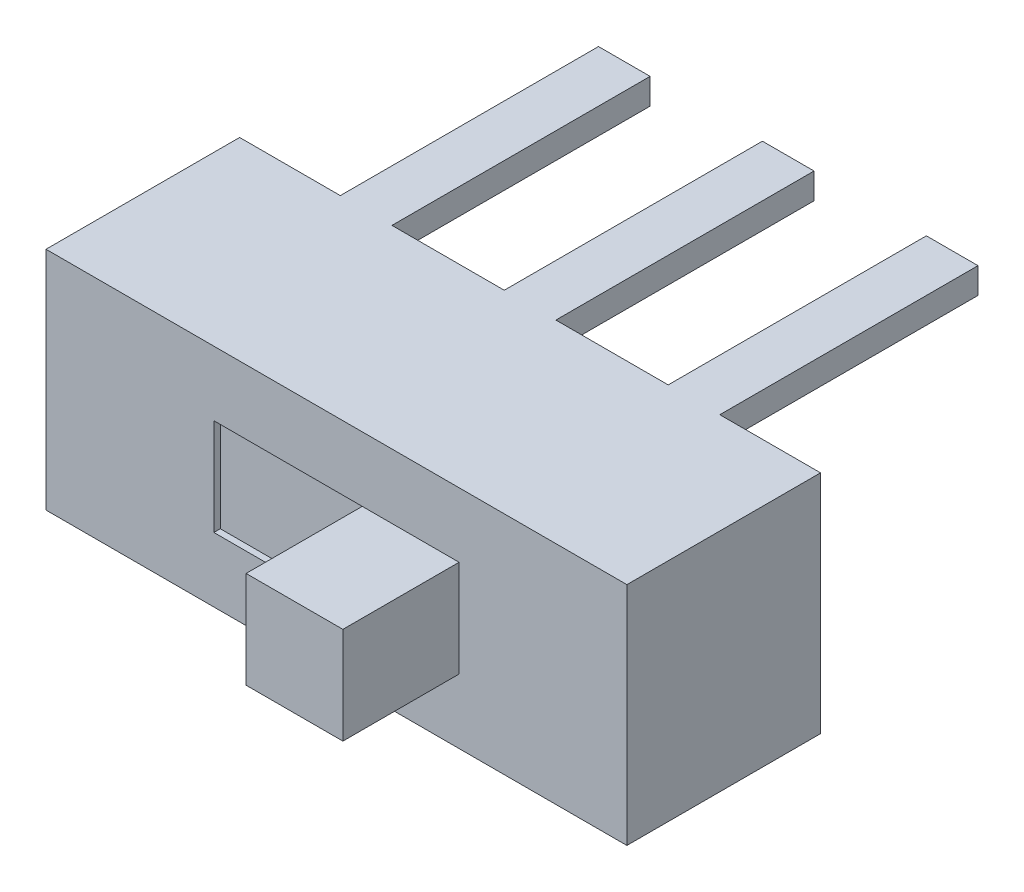
ISO-10303-21;
HEADER;
FILE_DESCRIPTION(('STEP AP214'),'2;1');
FILE_NAME('part.step','',(''),(''),'','','');
FILE_SCHEMA(('AUTOMOTIVE_DESIGN { 1 0 10303 214 1 1 1 1 }'));
ENDSEC;
DATA;
#1=APPLICATION_CONTEXT('core data for automotive mechanical design processes');
#2=APPLICATION_PROTOCOL_DEFINITION('international standard','automotive_design',2000,#1);
#3=PRODUCT_CONTEXT('',#1,'mechanical');
#4=PRODUCT('Part','Part','',(#3));
#5=PRODUCT_RELATED_PRODUCT_CATEGORY('part','',(#4));
#6=PRODUCT_DEFINITION_FORMATION('','',#4);
#7=PRODUCT_DEFINITION_CONTEXT('part definition',#1,'design');
#8=PRODUCT_DEFINITION('design','',#6,#7);
#9=PRODUCT_DEFINITION_SHAPE('','',#8);
#10=(LENGTH_UNIT() NAMED_UNIT(*) SI_UNIT(.MILLI.,.METRE.));
#11=(NAMED_UNIT(*) PLANE_ANGLE_UNIT() SI_UNIT($,.RADIAN.));
#12=(NAMED_UNIT(*) SI_UNIT($,.STERADIAN.) SOLID_ANGLE_UNIT());
#13=UNCERTAINTY_MEASURE_WITH_UNIT(LENGTH_MEASURE(1.E-05),#10,'distance_accuracy_value','');
#14=(GEOMETRIC_REPRESENTATION_CONTEXT(3) GLOBAL_UNCERTAINTY_ASSIGNED_CONTEXT((#13)) GLOBAL_UNIT_ASSIGNED_CONTEXT((#10,
#11,#12)) REPRESENTATION_CONTEXT('',''));
#15=CARTESIAN_POINT('',(0.,0.,0.));
#16=DIRECTION('',(0.,0.,1.));
#17=DIRECTION('',(1.,0.,0.));
#18=AXIS2_PLACEMENT_3D('',#15,#16,#17);
#19=CARTESIAN_POINT('',(-4.5,3.5,-1.5));
#20=DIRECTION('',(0.,0.,1.));
#21=DIRECTION('',(1.,0.,0.));
#22=AXIS2_PLACEMENT_3D('',#19,#20,#21);
#23=PLANE('',#22);
#24=DIRECTION('',(0.,-1.,0.));
#25=VECTOR('',#24,1.);
#26=CARTESIAN_POINT('',(-2.14,3.1,-1.5));
#27=LINE('',#26,#25);
#28=CARTESIAN_POINT('',(-2.14,3.5,-1.5));
#29=VERTEX_POINT('',#28);
#30=CARTESIAN_POINT('',(-2.14,3.1,-1.5));
#31=VERTEX_POINT('',#30);
#32=EDGE_CURVE('E390',#29,#31,#27,.T.);
#33=ORIENTED_EDGE('',*,*,#32,.F.);
#34=DIRECTION('',(-1.,0.,0.));
#35=VECTOR('',#34,1.);
#36=CARTESIAN_POINT('',(-4.5,3.5,-1.5));
#37=LINE('',#36,#35);
#38=CARTESIAN_POINT('',(-0.4,3.5,-1.5));
#39=VERTEX_POINT('',#38);
#40=EDGE_CURVE('E213',#39,#29,#37,.T.);
#41=ORIENTED_EDGE('',*,*,#40,.F.);
#42=DIRECTION('',(0.,1.,0.));
#43=VECTOR('',#42,1.);
#44=CARTESIAN_POINT('',(-0.4,3.1,-1.5));
#45=LINE('',#44,#43);
#46=CARTESIAN_POINT('',(-0.4,3.1,-1.5));
#47=VERTEX_POINT('',#46);
#48=EDGE_CURVE('E226',#47,#39,#45,.T.);
#49=ORIENTED_EDGE('',*,*,#48,.F.);
#50=DIRECTION('',(-1.,0.,0.));
#51=VECTOR('',#50,1.);
#52=CARTESIAN_POINT('',(0.4,3.1,-1.5));
#53=LINE('',#52,#51);
#54=CARTESIAN_POINT('',(0.4,3.1,-1.5));
#55=VERTEX_POINT('',#54);
#56=EDGE_CURVE('E216',#55,#47,#53,.T.);
#57=ORIENTED_EDGE('',*,*,#56,.F.);
#58=DIRECTION('',(0.,-1.,0.));
#59=VECTOR('',#58,1.);
#60=CARTESIAN_POINT('',(0.4,3.1,-1.5));
#61=LINE('',#60,#59);
#62=CARTESIAN_POINT('',(0.4,3.5,-1.5));
#63=VERTEX_POINT('',#62);
#64=EDGE_CURVE('E214',#63,#55,#61,.T.);
#65=ORIENTED_EDGE('',*,*,#64,.F.);
#66=CARTESIAN_POINT('',(2.14,3.5,-1.5));
#67=VERTEX_POINT('',#66);
#68=EDGE_CURVE('E333',#67,#63,#37,.T.);
#69=ORIENTED_EDGE('',*,*,#68,.F.);
#70=DIRECTION('',(0.,1.,0.));
#71=VECTOR('',#70,1.);
#72=CARTESIAN_POINT('',(2.14,3.1,-1.5));
#73=LINE('',#72,#71);
#74=CARTESIAN_POINT('',(2.14,3.1,-1.5));
#75=VERTEX_POINT('',#74);
#76=EDGE_CURVE('E243',#75,#67,#73,.T.);
#77=ORIENTED_EDGE('',*,*,#76,.F.);
#78=DIRECTION('',(-1.,0.,0.));
#79=VECTOR('',#78,1.);
#80=CARTESIAN_POINT('',(2.94,3.1,-1.5));
#81=LINE('',#80,#79);
#82=CARTESIAN_POINT('',(2.94,3.1,-1.5));
#83=VERTEX_POINT('',#82);
#84=EDGE_CURVE('E248',#83,#75,#81,.T.);
#85=ORIENTED_EDGE('',*,*,#84,.F.);
#86=DIRECTION('',(0.,-1.,0.));
#87=VECTOR('',#86,1.);
#88=CARTESIAN_POINT('',(2.94,3.1,-1.5));
#89=LINE('',#88,#87);
#90=CARTESIAN_POINT('',(2.94,3.5,-1.5));
#91=VERTEX_POINT('',#90);
#92=EDGE_CURVE('E257',#91,#83,#89,.T.);
#93=ORIENTED_EDGE('',*,*,#92,.F.);
#94=CARTESIAN_POINT('',(4.5,3.5,-1.5));
#95=VERTEX_POINT('',#94);
#96=EDGE_CURVE('E329',#95,#91,#37,.T.);
#97=ORIENTED_EDGE('',*,*,#96,.F.);
#98=DIRECTION('',(0.,-1.,0.));
#99=VECTOR('',#98,1.);
#100=CARTESIAN_POINT('',(4.5,3.5,-1.5));
#101=LINE('',#100,#99);
#102=CARTESIAN_POINT('',(4.5,0.,-1.5));
#103=VERTEX_POINT('',#102);
#104=EDGE_CURVE('E11',#95,#103,#101,.T.);
#105=ORIENTED_EDGE('',*,*,#104,.T.);
#106=DIRECTION('',(-1.,0.,0.));
#107=VECTOR('',#106,1.);
#108=CARTESIAN_POINT('',(-4.5,0.,-1.5));
#109=LINE('',#108,#107);
#110=CARTESIAN_POINT('',(-4.5,0.,-1.5));
#111=VERTEX_POINT('',#110);
#112=EDGE_CURVE('E340',#103,#111,#109,.T.);
#113=ORIENTED_EDGE('',*,*,#112,.T.);
#114=DIRECTION('',(0.,-1.,0.));
#115=VECTOR('',#114,1.);
#116=CARTESIAN_POINT('',(-4.5,3.5,-1.5));
#117=LINE('',#116,#115);
#118=CARTESIAN_POINT('',(-4.5,3.5,-1.5));
#119=VERTEX_POINT('',#118);
#120=EDGE_CURVE('E44',#119,#111,#117,.T.);
#121=ORIENTED_EDGE('',*,*,#120,.F.);
#122=CARTESIAN_POINT('',(-2.94,3.5,-1.5));
#123=VERTEX_POINT('',#122);
#124=EDGE_CURVE('E327',#123,#119,#37,.T.);
#125=ORIENTED_EDGE('',*,*,#124,.F.);
#126=DIRECTION('',(0.,1.,0.));
#127=VECTOR('',#126,1.);
#128=CARTESIAN_POINT('',(-2.94,3.1,-1.5));
#129=LINE('',#128,#127);
#130=CARTESIAN_POINT('',(-2.94,3.1,-1.5));
#131=VERTEX_POINT('',#130);
#132=EDGE_CURVE('E208',#131,#123,#129,.T.);
#133=ORIENTED_EDGE('',*,*,#132,.F.);
#134=DIRECTION('',(-1.,0.,0.));
#135=VECTOR('',#134,1.);
#136=CARTESIAN_POINT('',(-2.14,3.1,-1.5));
#137=LINE('',#136,#135);
#138=EDGE_CURVE('E391',#31,#131,#137,.T.);
#139=ORIENTED_EDGE('',*,*,#138,.F.);
#140=EDGE_LOOP('',(#33,#41,#49,#57,#65,#69,#77,#85,#93,#97,#105,#113,#121,#125,#133,#139));
#141=FACE_BOUND('',#140,.T.);
#142=ADVANCED_FACE('F36',(#141),#23,.F.);
#143=CARTESIAN_POINT('',(-1.9,1.,1.4));
#144=DIRECTION('',(0.,-1.,0.));
#145=DIRECTION('',(0.,0.,-1.));
#146=AXIS2_PLACEMENT_3D('',#143,#144,#145);
#147=PLANE('',#146);
#148=DIRECTION('',(0.,0.,-1.));
#149=VECTOR('',#148,1.);
#150=CARTESIAN_POINT('',(0.400000000000001,1.,3.3));
#151=LINE('',#150,#149);
#152=CARTESIAN_POINT('',(0.400000000000001,1.,1.5));
#153=VERTEX_POINT('',#152);
#154=CARTESIAN_POINT('',(0.400000000000001,1.,1.4));
#155=VERTEX_POINT('',#154);
#156=EDGE_CURVE('E287',#153,#155,#151,.T.);
#157=ORIENTED_EDGE('',*,*,#156,.T.);
#158=DIRECTION('',(1.,0.,0.));
#159=VECTOR('',#158,1.);
#160=CARTESIAN_POINT('',(-1.9,1.,1.4));
#161=LINE('',#160,#159);
#162=CARTESIAN_POINT('',(-1.9,1.,1.4));
#163=VERTEX_POINT('',#162);
#164=EDGE_CURVE('E307',#163,#155,#161,.T.);
#165=ORIENTED_EDGE('',*,*,#164,.F.);
#166=DIRECTION('',(0.,0.,1.));
#167=VECTOR('',#166,1.);
#168=CARTESIAN_POINT('',(-1.9,1.,1.4));
#169=LINE('',#168,#167);
#170=CARTESIAN_POINT('',(-1.9,1.,1.5));
#171=VERTEX_POINT('',#170);
#172=EDGE_CURVE('E320',#163,#171,#169,.T.);
#173=ORIENTED_EDGE('',*,*,#172,.T.);
#174=DIRECTION('',(1.,0.,0.));
#175=VECTOR('',#174,1.);
#176=CARTESIAN_POINT('',(-1.9,1.,1.5));
#177=LINE('',#176,#175);
#178=EDGE_CURVE('E304',#171,#153,#177,.T.);
#179=ORIENTED_EDGE('',*,*,#178,.T.);
#180=EDGE_LOOP('',(#157,#165,#173,#179));
#181=FACE_BOUND('',#180,.T.);
#182=ADVANCED_FACE('F413',(#181),#147,.F.);
#183=CARTESIAN_POINT('',(-1.9,2.5,1.4));
#184=DIRECTION('',(0.,1.,0.));
#185=DIRECTION('',(0.,0.,1.));
#186=AXIS2_PLACEMENT_3D('',#183,#184,#185);
#187=PLANE('',#186);
#188=DIRECTION('',(0.,0.,-1.));
#189=VECTOR('',#188,1.);
#190=CARTESIAN_POINT('',(0.4,2.5,3.3));
#191=LINE('',#190,#189);
#192=CARTESIAN_POINT('',(0.4,2.5,1.5));
#193=VERTEX_POINT('',#192);
#194=CARTESIAN_POINT('',(0.4,2.5,1.4));
#195=VERTEX_POINT('',#194);
#196=EDGE_CURVE('E291',#193,#195,#191,.T.);
#197=ORIENTED_EDGE('',*,*,#196,.F.);
#198=DIRECTION('',(-1.,0.,0.));
#199=VECTOR('',#198,1.);
#200=CARTESIAN_POINT('',(-1.9,2.5,1.5));
#201=LINE('',#200,#199);
#202=CARTESIAN_POINT('',(-1.9,2.5,1.5));
#203=VERTEX_POINT('',#202);
#204=EDGE_CURVE('E312',#193,#203,#201,.T.);
#205=ORIENTED_EDGE('',*,*,#204,.T.);
#206=DIRECTION('',(0.,0.,1.));
#207=VECTOR('',#206,1.);
#208=CARTESIAN_POINT('',(-1.9,2.5,1.4));
#209=LINE('',#208,#207);
#210=CARTESIAN_POINT('',(-1.9,2.5,1.4));
#211=VERTEX_POINT('',#210);
#212=EDGE_CURVE('E310',#211,#203,#209,.T.);
#213=ORIENTED_EDGE('',*,*,#212,.F.);
#214=DIRECTION('',(-1.,0.,0.));
#215=VECTOR('',#214,1.);
#216=CARTESIAN_POINT('',(-1.9,2.5,1.4));
#217=LINE('',#216,#215);
#218=EDGE_CURVE('E301',#195,#211,#217,.T.);
#219=ORIENTED_EDGE('',*,*,#218,.F.);
#220=EDGE_LOOP('',(#197,#205,#213,#219));
#221=FACE_BOUND('',#220,.T.);
#222=ADVANCED_FACE('F417',(#221),#187,.F.);
#223=CARTESIAN_POINT('',(0.,0.,1.4));
#224=DIRECTION('',(0.,0.,1.));
#225=DIRECTION('',(1.,0.,0.));
#226=AXIS2_PLACEMENT_3D('',#223,#224,#225);
#227=PLANE('',#226);
#228=ORIENTED_EDGE('',*,*,#164,.T.);
#229=DIRECTION('',(0.,-1.,0.));
#230=VECTOR('',#229,1.);
#231=CARTESIAN_POINT('',(0.4,2.5,1.4));
#232=LINE('',#231,#230);
#233=EDGE_CURVE('E273',#195,#155,#232,.T.);
#234=ORIENTED_EDGE('',*,*,#233,.F.);
#235=ORIENTED_EDGE('',*,*,#218,.T.);
#236=DIRECTION('',(0.,-1.,0.));
#237=VECTOR('',#236,1.);
#238=CARTESIAN_POINT('',(-1.9,2.5,1.4));
#239=LINE('',#238,#237);
#240=EDGE_CURVE('E303',#211,#163,#239,.T.);
#241=ORIENTED_EDGE('',*,*,#240,.T.);
#242=EDGE_LOOP('',(#228,#234,#235,#241));
#243=FACE_BOUND('',#242,.T.);
#244=ADVANCED_FACE('F433',(#243),#227,.T.);
#245=CARTESIAN_POINT('',(4.5,3.5,-1.5));
#246=DIRECTION('',(-1.,0.,0.));
#247=DIRECTION('',(0.,0.,1.));
#248=AXIS2_PLACEMENT_3D('',#245,#246,#247);
#249=PLANE('',#248);
#250=DIRECTION('',(0.,0.,-1.));
#251=VECTOR('',#250,1.);
#252=CARTESIAN_POINT('',(4.5,0.,-1.5));
#253=LINE('',#252,#251);
#254=CARTESIAN_POINT('',(4.5,0.,1.5));
#255=VERTEX_POINT('',#254);
#256=EDGE_CURVE('E322',#255,#103,#253,.T.);
#257=ORIENTED_EDGE('',*,*,#256,.T.);
#258=ORIENTED_EDGE('',*,*,#104,.F.);
#259=DIRECTION('',(0.,0.,-1.));
#260=VECTOR('',#259,1.);
#261=CARTESIAN_POINT('',(4.5,3.5,-1.5));
#262=LINE('',#261,#260);
#263=CARTESIAN_POINT('',(4.5,3.5,1.5));
#264=VERTEX_POINT('',#263);
#265=EDGE_CURVE('E325',#264,#95,#262,.T.);
#266=ORIENTED_EDGE('',*,*,#265,.F.);
#267=DIRECTION('',(0.,-1.,0.));
#268=VECTOR('',#267,1.);
#269=CARTESIAN_POINT('',(4.5,3.5,1.5));
#270=LINE('',#269,#268);
#271=EDGE_CURVE('E337',#264,#255,#270,.T.);
#272=ORIENTED_EDGE('',*,*,#271,.T.);
#273=EDGE_LOOP('',(#257,#258,#266,#272));
#274=FACE_BOUND('',#273,.T.);
#275=ADVANCED_FACE('F38',(#274),#249,.F.);
#276=CARTESIAN_POINT('',(-4.5,3.5,-1.5));
#277=DIRECTION('',(1.,0.,0.));
#278=DIRECTION('',(0.,0.,-1.));
#279=AXIS2_PLACEMENT_3D('',#276,#277,#278);
#280=PLANE('',#279);
#281=DIRECTION('',(0.,0.,1.));
#282=VECTOR('',#281,1.);
#283=CARTESIAN_POINT('',(-4.5,0.,-1.5));
#284=LINE('',#283,#282);
#285=CARTESIAN_POINT('',(-4.5,0.,1.5));
#286=VERTEX_POINT('',#285);
#287=EDGE_CURVE('E342',#111,#286,#284,.T.);
#288=ORIENTED_EDGE('',*,*,#287,.T.);
#289=DIRECTION('',(0.,-1.,0.));
#290=VECTOR('',#289,1.);
#291=CARTESIAN_POINT('',(-4.5,3.5,1.5));
#292=LINE('',#291,#290);
#293=CARTESIAN_POINT('',(-4.5,3.5,1.5));
#294=VERTEX_POINT('',#293);
#295=EDGE_CURVE('E347',#294,#286,#292,.T.);
#296=ORIENTED_EDGE('',*,*,#295,.F.);
#297=DIRECTION('',(0.,0.,1.));
#298=VECTOR('',#297,1.);
#299=CARTESIAN_POINT('',(-4.5,3.5,-1.5));
#300=LINE('',#299,#298);
#301=EDGE_CURVE('E332',#119,#294,#300,.T.);
#302=ORIENTED_EDGE('',*,*,#301,.F.);
#303=ORIENTED_EDGE('',*,*,#120,.T.);
#304=EDGE_LOOP('',(#288,#296,#302,#303));
#305=FACE_BOUND('',#304,.T.);
#306=ADVANCED_FACE('F354',(#305),#280,.F.);
#307=CARTESIAN_POINT('',(-4.5,3.5,1.5));
#308=DIRECTION('',(0.,0.,-1.));
#309=DIRECTION('',(-1.,0.,0.));
#310=AXIS2_PLACEMENT_3D('',#307,#308,#309);
#311=PLANE('',#310);
#312=CARTESIAN_POINT('',(1.9,2.5,1.5));
#313=VERTEX_POINT('',#312);
#314=EDGE_CURVE('E313',#313,#193,#201,.T.);
#315=ORIENTED_EDGE('',*,*,#314,.F.);
#316=DIRECTION('',(0.,1.,0.));
#317=VECTOR('',#316,1.);
#318=CARTESIAN_POINT('',(1.9,2.5,1.5));
#319=LINE('',#318,#317);
#320=CARTESIAN_POINT('',(1.9,1.,1.5));
#321=VERTEX_POINT('',#320);
#322=EDGE_CURVE('E300',#321,#313,#319,.T.);
#323=ORIENTED_EDGE('',*,*,#322,.F.);
#324=DIRECTION('',(1.,0.,0.));
#325=VECTOR('',#324,1.);
#326=CARTESIAN_POINT('',(-4.5,1.,1.5));
#327=LINE('',#326,#325);
#328=EDGE_CURVE('E298',#153,#321,#327,.T.);
#329=ORIENTED_EDGE('',*,*,#328,.F.);
#330=ORIENTED_EDGE('',*,*,#178,.F.);
#331=DIRECTION('',(0.,-1.,0.));
#332=VECTOR('',#331,1.);
#333=CARTESIAN_POINT('',(-1.9,2.5,1.5));
#334=LINE('',#333,#332);
#335=EDGE_CURVE('E315',#203,#171,#334,.T.);
#336=ORIENTED_EDGE('',*,*,#335,.F.);
#337=ORIENTED_EDGE('',*,*,#204,.F.);
#338=EDGE_LOOP('',(#315,#323,#329,#330,#336,#337));
#339=FACE_BOUND('',#338,.T.);
#340=DIRECTION('',(1.,0.,0.));
#341=VECTOR('',#340,1.);
#342=CARTESIAN_POINT('',(-4.5,0.,1.5));
#343=LINE('',#342,#341);
#344=EDGE_CURVE('E328',#286,#255,#343,.T.);
#345=ORIENTED_EDGE('',*,*,#344,.T.);
#346=ORIENTED_EDGE('',*,*,#271,.F.);
#347=DIRECTION('',(1.,0.,0.));
#348=VECTOR('',#347,1.);
#349=CARTESIAN_POINT('',(-4.5,3.5,1.5));
#350=LINE('',#349,#348);
#351=EDGE_CURVE('E335',#294,#264,#350,.T.);
#352=ORIENTED_EDGE('',*,*,#351,.F.);
#353=ORIENTED_EDGE('',*,*,#295,.T.);
#354=EDGE_LOOP('',(#345,#346,#352,#353));
#355=FACE_BOUND('',#354,.T.);
#356=ADVANCED_FACE('F364',(#339,#355),#311,.F.);
#357=CARTESIAN_POINT('',(0.,3.5,0.));
#358=DIRECTION('',(0.,1.,0.));
#359=DIRECTION('',(0.,0.,1.));
#360=AXIS2_PLACEMENT_3D('',#357,#358,#359);
#361=PLANE('',#360);
#362=ORIENTED_EDGE('',*,*,#265,.T.);
#363=ORIENTED_EDGE('',*,*,#96,.T.);
#364=DIRECTION('',(0.,0.,1.));
#365=VECTOR('',#364,1.);
#366=CARTESIAN_POINT('',(2.94,3.5,-5.5));
#367=LINE('',#366,#365);
#368=CARTESIAN_POINT('',(2.94,3.5,-5.5));
#369=VERTEX_POINT('',#368);
#370=EDGE_CURVE('E267',#369,#91,#367,.T.);
#371=ORIENTED_EDGE('',*,*,#370,.F.);
#372=DIRECTION('',(1.,0.,0.));
#373=VECTOR('',#372,1.);
#374=CARTESIAN_POINT('',(2.94,3.5,-5.5));
#375=LINE('',#374,#373);
#376=CARTESIAN_POINT('',(2.14,3.5,-5.5));
#377=VERTEX_POINT('',#376);
#378=EDGE_CURVE('E247',#377,#369,#375,.T.);
#379=ORIENTED_EDGE('',*,*,#378,.F.);
#380=DIRECTION('',(0.,0.,1.));
#381=VECTOR('',#380,1.);
#382=CARTESIAN_POINT('',(2.14,3.5,-5.5));
#383=LINE('',#382,#381);
#384=EDGE_CURVE('E270',#377,#67,#383,.T.);
#385=ORIENTED_EDGE('',*,*,#384,.T.);
#386=ORIENTED_EDGE('',*,*,#68,.T.);
#387=DIRECTION('',(0.,0.,1.));
#388=VECTOR('',#387,1.);
#389=CARTESIAN_POINT('',(0.4,3.5,-5.5));
#390=LINE('',#389,#388);
#391=CARTESIAN_POINT('',(0.4,3.5,-5.5));
#392=VERTEX_POINT('',#391);
#393=EDGE_CURVE('E241',#392,#63,#390,.T.);
#394=ORIENTED_EDGE('',*,*,#393,.F.);
#395=DIRECTION('',(1.,0.,0.));
#396=VECTOR('',#395,1.);
#397=CARTESIAN_POINT('',(0.4,3.5,-5.5));
#398=LINE('',#397,#396);
#399=CARTESIAN_POINT('',(-0.4,3.5,-5.5));
#400=VERTEX_POINT('',#399);
#401=EDGE_CURVE('E222',#400,#392,#398,.T.);
#402=ORIENTED_EDGE('',*,*,#401,.F.);
#403=DIRECTION('',(0.,0.,1.));
#404=VECTOR('',#403,1.);
#405=CARTESIAN_POINT('',(-0.4,3.5,-5.5));
#406=LINE('',#405,#404);
#407=EDGE_CURVE('E58',#400,#39,#406,.T.);
#408=ORIENTED_EDGE('',*,*,#407,.T.);
#409=ORIENTED_EDGE('',*,*,#40,.T.);
#410=DIRECTION('',(0.,0.,1.));
#411=VECTOR('',#410,1.);
#412=CARTESIAN_POINT('',(-2.14,3.5,-5.5));
#413=LINE('',#412,#411);
#414=CARTESIAN_POINT('',(-2.14,3.5,-5.5));
#415=VERTEX_POINT('',#414);
#416=EDGE_CURVE('E196',#415,#29,#413,.T.);
#417=ORIENTED_EDGE('',*,*,#416,.F.);
#418=DIRECTION('',(1.,0.,0.));
#419=VECTOR('',#418,1.);
#420=CARTESIAN_POINT('',(-2.14,3.5,-5.5));
#421=LINE('',#420,#419);
#422=CARTESIAN_POINT('',(-2.94,3.5,-5.5));
#423=VERTEX_POINT('',#422);
#424=EDGE_CURVE('E203',#423,#415,#421,.T.);
#425=ORIENTED_EDGE('',*,*,#424,.F.);
#426=DIRECTION('',(0.,0.,1.));
#427=VECTOR('',#426,1.);
#428=CARTESIAN_POINT('',(-2.94,3.5,-5.5));
#429=LINE('',#428,#427);
#430=EDGE_CURVE('E51',#423,#123,#429,.T.);
#431=ORIENTED_EDGE('',*,*,#430,.T.);
#432=ORIENTED_EDGE('',*,*,#124,.T.);
#433=ORIENTED_EDGE('',*,*,#301,.T.);
#434=ORIENTED_EDGE('',*,*,#351,.T.);
#435=EDGE_LOOP('',(#362,#363,#371,#379,#385,#386,#394,#402,#408,#409,#417,#425,#431,#432,#433,#434));
#436=FACE_BOUND('',#435,.T.);
#437=ADVANCED_FACE('F211',(#436),#361,.T.);
#438=CARTESIAN_POINT('',(0.,0.,0.));
#439=DIRECTION('',(0.,1.,0.));
#440=DIRECTION('',(0.,0.,1.));
#441=AXIS2_PLACEMENT_3D('',#438,#439,#440);
#442=PLANE('',#441);
#443=ORIENTED_EDGE('',*,*,#256,.F.);
#444=ORIENTED_EDGE('',*,*,#344,.F.);
#445=ORIENTED_EDGE('',*,*,#287,.F.);
#446=ORIENTED_EDGE('',*,*,#112,.F.);
#447=EDGE_LOOP('',(#443,#444,#445,#446));
#448=FACE_BOUND('',#447,.T.);
#449=ADVANCED_FACE('F361',(#448),#442,.F.);
#450=CARTESIAN_POINT('',(-1.9,2.5,1.4));
#451=DIRECTION('',(-1.,0.,0.));
#452=DIRECTION('',(0.,-1.,0.));
#453=AXIS2_PLACEMENT_3D('',#450,#451,#452);
#454=PLANE('',#453);
#455=ORIENTED_EDGE('',*,*,#335,.T.);
#456=ORIENTED_EDGE('',*,*,#172,.F.);
#457=ORIENTED_EDGE('',*,*,#240,.F.);
#458=ORIENTED_EDGE('',*,*,#212,.T.);
#459=EDGE_LOOP('',(#455,#456,#457,#458));
#460=FACE_BOUND('',#459,.T.);
#461=ADVANCED_FACE('F428',(#460),#454,.F.);
#462=CARTESIAN_POINT('',(1.9,2.5,3.3));
#463=DIRECTION('',(-1.,0.,0.));
#464=DIRECTION('',(0.,0.,1.));
#465=AXIS2_PLACEMENT_3D('',#462,#463,#464);
#466=PLANE('',#465);
#467=DIRECTION('',(0.,0.,-1.));
#468=VECTOR('',#467,1.);
#469=CARTESIAN_POINT('',(1.9,1.,3.3));
#470=LINE('',#469,#468);
#471=CARTESIAN_POINT('',(1.9,1.,3.3));
#472=VERTEX_POINT('',#471);
#473=EDGE_CURVE('E283',#472,#321,#470,.T.);
#474=ORIENTED_EDGE('',*,*,#473,.T.);
#475=ORIENTED_EDGE('',*,*,#322,.T.);
#476=DIRECTION('',(0.,0.,-1.));
#477=VECTOR('',#476,1.);
#478=CARTESIAN_POINT('',(1.9,2.5,3.3));
#479=LINE('',#478,#477);
#480=CARTESIAN_POINT('',(1.9,2.5,3.3));
#481=VERTEX_POINT('',#480);
#482=EDGE_CURVE('E295',#481,#313,#479,.T.);
#483=ORIENTED_EDGE('',*,*,#482,.F.);
#484=DIRECTION('',(0.,1.,0.));
#485=VECTOR('',#484,1.);
#486=CARTESIAN_POINT('',(1.9,2.5,3.3));
#487=LINE('',#486,#485);
#488=EDGE_CURVE('E274',#472,#481,#487,.T.);
#489=ORIENTED_EDGE('',*,*,#488,.F.);
#490=EDGE_LOOP('',(#474,#475,#483,#489));
#491=FACE_BOUND('',#490,.T.);
#492=ADVANCED_FACE('F436',(#491),#466,.F.);
#493=CARTESIAN_POINT('',(1.9,2.5,3.3));
#494=DIRECTION('',(0.,-1.,0.));
#495=DIRECTION('',(0.,0.,-1.));
#496=AXIS2_PLACEMENT_3D('',#493,#494,#495);
#497=PLANE('',#496);
#498=ORIENTED_EDGE('',*,*,#482,.T.);
#499=ORIENTED_EDGE('',*,*,#314,.T.);
#500=CARTESIAN_POINT('',(0.4,2.5,3.3));
#501=VERTEX_POINT('',#500);
#502=EDGE_CURVE('E292',#501,#193,#191,.T.);
#503=ORIENTED_EDGE('',*,*,#502,.F.);
#504=DIRECTION('',(-1.,0.,0.));
#505=VECTOR('',#504,1.);
#506=CARTESIAN_POINT('',(1.9,2.5,3.3));
#507=LINE('',#506,#505);
#508=EDGE_CURVE('E277',#481,#501,#507,.T.);
#509=ORIENTED_EDGE('',*,*,#508,.F.);
#510=EDGE_LOOP('',(#498,#499,#503,#509));
#511=FACE_BOUND('',#510,.T.);
#512=ADVANCED_FACE('F444',(#511),#497,.F.);
#513=CARTESIAN_POINT('',(1.9,1.,3.3));
#514=DIRECTION('',(0.,1.,0.));
#515=DIRECTION('',(0.,0.,1.));
#516=AXIS2_PLACEMENT_3D('',#513,#514,#515);
#517=PLANE('',#516);
#518=CARTESIAN_POINT('',(0.400000000000001,1.,3.3));
#519=VERTEX_POINT('',#518);
#520=EDGE_CURVE('E288',#519,#153,#151,.T.);
#521=ORIENTED_EDGE('',*,*,#520,.T.);
#522=ORIENTED_EDGE('',*,*,#328,.T.);
#523=ORIENTED_EDGE('',*,*,#473,.F.);
#524=DIRECTION('',(1.,0.,0.));
#525=VECTOR('',#524,1.);
#526=CARTESIAN_POINT('',(1.9,1.,3.3));
#527=LINE('',#526,#525);
#528=EDGE_CURVE('E281',#519,#472,#527,.T.);
#529=ORIENTED_EDGE('',*,*,#528,.F.);
#530=EDGE_LOOP('',(#521,#522,#523,#529));
#531=FACE_BOUND('',#530,.T.);
#532=ADVANCED_FACE('F448',(#531),#517,.F.);
#533=CARTESIAN_POINT('',(0.4,2.5,3.3));
#534=DIRECTION('',(1.,0.,0.));
#535=DIRECTION('',(0.,1.,0.));
#536=AXIS2_PLACEMENT_3D('',#533,#534,#535);
#537=PLANE('',#536);
#538=ORIENTED_EDGE('',*,*,#233,.T.);
#539=ORIENTED_EDGE('',*,*,#156,.F.);
#540=ORIENTED_EDGE('',*,*,#520,.F.);
#541=DIRECTION('',(0.,-1.,0.));
#542=VECTOR('',#541,1.);
#543=CARTESIAN_POINT('',(0.4,2.5,3.3));
#544=LINE('',#543,#542);
#545=EDGE_CURVE('E279',#501,#519,#544,.T.);
#546=ORIENTED_EDGE('',*,*,#545,.F.);
#547=ORIENTED_EDGE('',*,*,#502,.T.);
#548=ORIENTED_EDGE('',*,*,#196,.T.);
#549=EDGE_LOOP('',(#538,#539,#540,#546,#547,#548));
#550=FACE_BOUND('',#549,.T.);
#551=ADVANCED_FACE('F450',(#550),#537,.F.);
#552=CARTESIAN_POINT('',(0.,0.,3.3));
#553=DIRECTION('',(0.,0.,-1.));
#554=DIRECTION('',(-1.,0.,0.));
#555=AXIS2_PLACEMENT_3D('',#552,#553,#554);
#556=PLANE('',#555);
#557=ORIENTED_EDGE('',*,*,#488,.T.);
#558=ORIENTED_EDGE('',*,*,#508,.T.);
#559=ORIENTED_EDGE('',*,*,#545,.T.);
#560=ORIENTED_EDGE('',*,*,#528,.T.);
#561=EDGE_LOOP('',(#557,#558,#559,#560));
#562=FACE_BOUND('',#561,.T.);
#563=ADVANCED_FACE('F453',(#562),#556,.F.);
#564=CARTESIAN_POINT('',(2.14,3.1,-5.5));
#565=DIRECTION('',(1.,0.,0.));
#566=DIRECTION('',(0.,0.,-1.));
#567=AXIS2_PLACEMENT_3D('',#564,#565,#566);
#568=PLANE('',#567);
#569=ORIENTED_EDGE('',*,*,#76,.T.);
#570=ORIENTED_EDGE('',*,*,#384,.F.);
#571=DIRECTION('',(0.,1.,0.));
#572=VECTOR('',#571,1.);
#573=CARTESIAN_POINT('',(2.14,3.1,-5.5));
#574=LINE('',#573,#572);
#575=CARTESIAN_POINT('',(2.14,3.1,-5.5));
#576=VERTEX_POINT('',#575);
#577=EDGE_CURVE('E244',#576,#377,#574,.T.);
#578=ORIENTED_EDGE('',*,*,#577,.F.);
#579=DIRECTION('',(0.,0.,1.));
#580=VECTOR('',#579,1.);
#581=CARTESIAN_POINT('',(2.14,3.1,-5.5));
#582=LINE('',#581,#580);
#583=EDGE_CURVE('E254',#576,#75,#582,.T.);
#584=ORIENTED_EDGE('',*,*,#583,.T.);
#585=EDGE_LOOP('',(#569,#570,#578,#584));
#586=FACE_BOUND('',#585,.T.);
#587=ADVANCED_FACE('F460',(#586),#568,.F.);
#588=CARTESIAN_POINT('',(2.94,3.1,-5.5));
#589=DIRECTION('',(-1.,0.,0.));
#590=DIRECTION('',(0.,0.,1.));
#591=AXIS2_PLACEMENT_3D('',#588,#589,#590);
#592=PLANE('',#591);
#593=ORIENTED_EDGE('',*,*,#92,.T.);
#594=DIRECTION('',(0.,0.,1.));
#595=VECTOR('',#594,1.);
#596=CARTESIAN_POINT('',(2.94,3.1,-5.5));
#597=LINE('',#596,#595);
#598=CARTESIAN_POINT('',(2.94,3.1,-5.5));
#599=VERTEX_POINT('',#598);
#600=EDGE_CURVE('E264',#599,#83,#597,.T.);
#601=ORIENTED_EDGE('',*,*,#600,.F.);
#602=DIRECTION('',(0.,-1.,0.));
#603=VECTOR('',#602,1.);
#604=CARTESIAN_POINT('',(2.94,3.1,-5.5));
#605=LINE('',#604,#603);
#606=EDGE_CURVE('E250',#369,#599,#605,.T.);
#607=ORIENTED_EDGE('',*,*,#606,.F.);
#608=ORIENTED_EDGE('',*,*,#370,.T.);
#609=EDGE_LOOP('',(#593,#601,#607,#608));
#610=FACE_BOUND('',#609,.T.);
#611=ADVANCED_FACE('F464',(#610),#592,.F.);
#612=CARTESIAN_POINT('',(2.94,3.1,-5.5));
#613=DIRECTION('',(0.,1.,0.));
#614=DIRECTION('',(0.,0.,1.));
#615=AXIS2_PLACEMENT_3D('',#612,#613,#614);
#616=PLANE('',#615);
#617=ORIENTED_EDGE('',*,*,#84,.T.);
#618=ORIENTED_EDGE('',*,*,#583,.F.);
#619=DIRECTION('',(-1.,0.,0.));
#620=VECTOR('',#619,1.);
#621=CARTESIAN_POINT('',(2.94,3.1,-5.5));
#622=LINE('',#621,#620);
#623=EDGE_CURVE('E252',#599,#576,#622,.T.);
#624=ORIENTED_EDGE('',*,*,#623,.F.);
#625=ORIENTED_EDGE('',*,*,#600,.T.);
#626=EDGE_LOOP('',(#617,#618,#624,#625));
#627=FACE_BOUND('',#626,.T.);
#628=ADVANCED_FACE('F468',(#627),#616,.F.);
#629=CARTESIAN_POINT('',(0.,0.,-5.5));
#630=DIRECTION('',(0.,0.,1.));
#631=DIRECTION('',(1.,0.,0.));
#632=AXIS2_PLACEMENT_3D('',#629,#630,#631);
#633=PLANE('',#632);
#634=ORIENTED_EDGE('',*,*,#577,.T.);
#635=ORIENTED_EDGE('',*,*,#378,.T.);
#636=ORIENTED_EDGE('',*,*,#606,.T.);
#637=ORIENTED_EDGE('',*,*,#623,.T.);
#638=EDGE_LOOP('',(#634,#635,#636,#637));
#639=FACE_BOUND('',#638,.T.);
#640=ADVANCED_FACE('F472',(#639),#633,.F.);
#641=CARTESIAN_POINT('',(0.4,3.1,-5.5));
#642=DIRECTION('',(-1.,0.,0.));
#643=DIRECTION('',(0.,-1.,0.));
#644=AXIS2_PLACEMENT_3D('',#641,#642,#643);
#645=PLANE('',#644);
#646=ORIENTED_EDGE('',*,*,#64,.T.);
#647=DIRECTION('',(0.,0.,1.));
#648=VECTOR('',#647,1.);
#649=CARTESIAN_POINT('',(0.4,3.1,-5.5));
#650=LINE('',#649,#648);
#651=CARTESIAN_POINT('',(0.4,3.1,-5.5));
#652=VERTEX_POINT('',#651);
#653=EDGE_CURVE('E238',#652,#55,#650,.T.);
#654=ORIENTED_EDGE('',*,*,#653,.F.);
#655=DIRECTION('',(0.,-1.,0.));
#656=VECTOR('',#655,1.);
#657=CARTESIAN_POINT('',(0.4,3.1,-5.5));
#658=LINE('',#657,#656);
#659=EDGE_CURVE('E225',#392,#652,#658,.T.);
#660=ORIENTED_EDGE('',*,*,#659,.F.);
#661=ORIENTED_EDGE('',*,*,#393,.T.);
#662=EDGE_LOOP('',(#646,#654,#660,#661));
#663=FACE_BOUND('',#662,.T.);
#664=ADVANCED_FACE('F379',(#663),#645,.F.);
#665=CARTESIAN_POINT('',(0.4,3.1,-5.5));
#666=DIRECTION('',(0.,1.,0.));
#667=DIRECTION('',(0.,0.,1.));
#668=AXIS2_PLACEMENT_3D('',#665,#666,#667);
#669=PLANE('',#668);
#670=ORIENTED_EDGE('',*,*,#56,.T.);
#671=DIRECTION('',(0.,0.,1.));
#672=VECTOR('',#671,1.);
#673=CARTESIAN_POINT('',(-0.4,3.1,-5.5));
#674=LINE('',#673,#672);
#675=CARTESIAN_POINT('',(-0.4,3.1,-5.5));
#676=VERTEX_POINT('',#675);
#677=EDGE_CURVE('E235',#676,#47,#674,.T.);
#678=ORIENTED_EDGE('',*,*,#677,.F.);
#679=DIRECTION('',(-1.,0.,0.));
#680=VECTOR('',#679,1.);
#681=CARTESIAN_POINT('',(0.4,3.1,-5.5));
#682=LINE('',#681,#680);
#683=EDGE_CURVE('E228',#652,#676,#682,.T.);
#684=ORIENTED_EDGE('',*,*,#683,.F.);
#685=ORIENTED_EDGE('',*,*,#653,.T.);
#686=EDGE_LOOP('',(#670,#678,#684,#685));
#687=FACE_BOUND('',#686,.T.);
#688=ADVANCED_FACE('F382',(#687),#669,.F.);
#689=CARTESIAN_POINT('',(-0.4,3.1,-5.5));
#690=DIRECTION('',(1.,0.,0.));
#691=DIRECTION('',(0.,1.,0.));
#692=AXIS2_PLACEMENT_3D('',#689,#690,#691);
#693=PLANE('',#692);
#694=ORIENTED_EDGE('',*,*,#48,.T.);
#695=ORIENTED_EDGE('',*,*,#407,.F.);
#696=DIRECTION('',(0.,1.,0.));
#697=VECTOR('',#696,1.);
#698=CARTESIAN_POINT('',(-0.4,3.1,-5.5));
#699=LINE('',#698,#697);
#700=EDGE_CURVE('E230',#676,#400,#699,.T.);
#701=ORIENTED_EDGE('',*,*,#700,.F.);
#702=ORIENTED_EDGE('',*,*,#677,.T.);
#703=EDGE_LOOP('',(#694,#695,#701,#702));
#704=FACE_BOUND('',#703,.T.);
#705=ADVANCED_FACE('F388',(#704),#693,.F.);
#706=CARTESIAN_POINT('',(0.,0.,-5.5));
#707=DIRECTION('',(0.,0.,-1.));
#708=DIRECTION('',(-1.,0.,0.));
#709=AXIS2_PLACEMENT_3D('',#706,#707,#708);
#710=PLANE('',#709);
#711=ORIENTED_EDGE('',*,*,#401,.T.);
#712=ORIENTED_EDGE('',*,*,#659,.T.);
#713=ORIENTED_EDGE('',*,*,#683,.T.);
#714=ORIENTED_EDGE('',*,*,#700,.T.);
#715=EDGE_LOOP('',(#711,#712,#713,#714));
#716=FACE_BOUND('',#715,.T.);
#717=ADVANCED_FACE('F386',(#716),#710,.T.);
#718=CARTESIAN_POINT('',(-2.14,3.1,-5.5));
#719=DIRECTION('',(-1.,0.,0.));
#720=DIRECTION('',(0.,0.,1.));
#721=AXIS2_PLACEMENT_3D('',#718,#719,#720);
#722=PLANE('',#721);
#723=ORIENTED_EDGE('',*,*,#32,.T.);
#724=DIRECTION('',(0.,0.,1.));
#725=VECTOR('',#724,1.);
#726=CARTESIAN_POINT('',(-2.14,3.1,-5.5));
#727=LINE('',#726,#725);
#728=CARTESIAN_POINT('',(-2.14,3.1,-5.5));
#729=VERTEX_POINT('',#728);
#730=EDGE_CURVE('E199',#729,#31,#727,.T.);
#731=ORIENTED_EDGE('',*,*,#730,.F.);
#732=DIRECTION('',(0.,-1.,0.));
#733=VECTOR('',#732,1.);
#734=CARTESIAN_POINT('',(-2.14,3.1,-5.5));
#735=LINE('',#734,#733);
#736=EDGE_CURVE('E192',#415,#729,#735,.T.);
#737=ORIENTED_EDGE('',*,*,#736,.F.);
#738=ORIENTED_EDGE('',*,*,#416,.T.);
#739=EDGE_LOOP('',(#723,#731,#737,#738));
#740=FACE_BOUND('',#739,.T.);
#741=ADVANCED_FACE('F194',(#740),#722,.F.);
#742=CARTESIAN_POINT('',(-2.14,3.1,-5.5));
#743=DIRECTION('',(0.,1.,0.));
#744=DIRECTION('',(0.,0.,1.));
#745=AXIS2_PLACEMENT_3D('',#742,#743,#744);
#746=PLANE('',#745);
#747=ORIENTED_EDGE('',*,*,#138,.T.);
#748=DIRECTION('',(0.,0.,1.));
#749=VECTOR('',#748,1.);
#750=CARTESIAN_POINT('',(-2.94,3.1,-5.5));
#751=LINE('',#750,#749);
#752=CARTESIAN_POINT('',(-2.94,3.1,-5.5));
#753=VERTEX_POINT('',#752);
#754=EDGE_CURVE('E218',#753,#131,#751,.T.);
#755=ORIENTED_EDGE('',*,*,#754,.F.);
#756=DIRECTION('',(-1.,0.,0.));
#757=VECTOR('',#756,1.);
#758=CARTESIAN_POINT('',(-2.14,3.1,-5.5));
#759=LINE('',#758,#757);
#760=EDGE_CURVE('E202',#729,#753,#759,.T.);
#761=ORIENTED_EDGE('',*,*,#760,.F.);
#762=ORIENTED_EDGE('',*,*,#730,.T.);
#763=EDGE_LOOP('',(#747,#755,#761,#762));
#764=FACE_BOUND('',#763,.T.);
#765=ADVANCED_FACE('F403',(#764),#746,.F.);
#766=CARTESIAN_POINT('',(-2.94,3.1,-5.5));
#767=DIRECTION('',(1.,0.,0.));
#768=DIRECTION('',(0.,0.,-1.));
#769=AXIS2_PLACEMENT_3D('',#766,#767,#768);
#770=PLANE('',#769);
#771=ORIENTED_EDGE('',*,*,#132,.T.);
#772=ORIENTED_EDGE('',*,*,#430,.F.);
#773=DIRECTION('',(0.,1.,0.));
#774=VECTOR('',#773,1.);
#775=CARTESIAN_POINT('',(-2.94,3.1,-5.5));
#776=LINE('',#775,#774);
#777=EDGE_CURVE('E207',#753,#423,#776,.T.);
#778=ORIENTED_EDGE('',*,*,#777,.F.);
#779=ORIENTED_EDGE('',*,*,#754,.T.);
#780=EDGE_LOOP('',(#771,#772,#778,#779));
#781=FACE_BOUND('',#780,.T.);
#782=ADVANCED_FACE('F401',(#781),#770,.F.);
#783=CARTESIAN_POINT('',(0.,0.,-5.5));
#784=DIRECTION('',(0.,0.,-1.));
#785=DIRECTION('',(-1.,0.,0.));
#786=AXIS2_PLACEMENT_3D('',#783,#784,#785);
#787=PLANE('',#786);
#788=ORIENTED_EDGE('',*,*,#424,.T.);
#789=ORIENTED_EDGE('',*,*,#736,.T.);
#790=ORIENTED_EDGE('',*,*,#760,.T.);
#791=ORIENTED_EDGE('',*,*,#777,.T.);
#792=EDGE_LOOP('',(#788,#789,#790,#791));
#793=FACE_BOUND('',#792,.T.);
#794=ADVANCED_FACE('F205',(#793),#787,.T.);
#795=CLOSED_SHELL('',(#142,#182,#222,#244,#275,#306,#356,#437,#449,#461,#492,#512,#532,#551,
#563,#587,#611,#628,#640,#664,#688,#705,#717,#741,#765,#782,#794));
#796=MANIFOLD_SOLID_BREP('B2',#795);
#797=ADVANCED_BREP_SHAPE_REPRESENTATION('',(#18,#796),#14);
#798=SHAPE_DEFINITION_REPRESENTATION(#9,#797);
ENDSEC;
END-ISO-10303-21;
